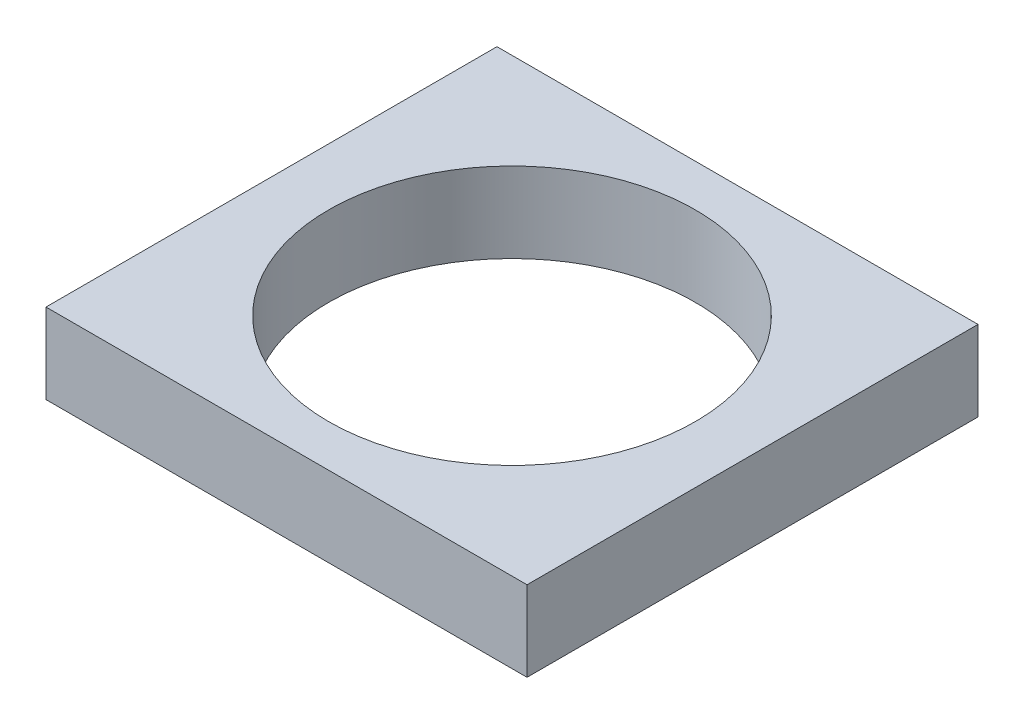
ISO-10303-21;
HEADER;
FILE_DESCRIPTION(('STEP AP214'),'2;1');
FILE_NAME('part.step','',(''),(''),'','','');
FILE_SCHEMA(('AUTOMOTIVE_DESIGN { 1 0 10303 214 1 1 1 1 }'));
ENDSEC;
DATA;
#1=APPLICATION_CONTEXT('core data for automotive mechanical design processes');
#2=APPLICATION_PROTOCOL_DEFINITION('international standard','automotive_design',2000,#1);
#3=PRODUCT_CONTEXT('',#1,'mechanical');
#4=PRODUCT('Part','Part','',(#3));
#5=PRODUCT_RELATED_PRODUCT_CATEGORY('part','',(#4));
#6=PRODUCT_DEFINITION_FORMATION('','',#4);
#7=PRODUCT_DEFINITION_CONTEXT('part definition',#1,'design');
#8=PRODUCT_DEFINITION('design','',#6,#7);
#9=PRODUCT_DEFINITION_SHAPE('','',#8);
#10=(LENGTH_UNIT() NAMED_UNIT(*) SI_UNIT(.MILLI.,.METRE.));
#11=(NAMED_UNIT(*) PLANE_ANGLE_UNIT() SI_UNIT($,.RADIAN.));
#12=(NAMED_UNIT(*) SI_UNIT($,.STERADIAN.) SOLID_ANGLE_UNIT());
#13=UNCERTAINTY_MEASURE_WITH_UNIT(LENGTH_MEASURE(1.E-05),#10,'distance_accuracy_value','');
#14=(GEOMETRIC_REPRESENTATION_CONTEXT(3) GLOBAL_UNCERTAINTY_ASSIGNED_CONTEXT((#13)) GLOBAL_UNIT_ASSIGNED_CONTEXT((#10,
#11,#12)) REPRESENTATION_CONTEXT('',''));
#15=CARTESIAN_POINT('',(0.,0.,0.));
#16=DIRECTION('',(0.,0.,1.));
#17=DIRECTION('',(1.,0.,0.));
#18=AXIS2_PLACEMENT_3D('',#15,#16,#17);
#19=CARTESIAN_POINT('',(0.,4.,0.));
#20=DIRECTION('',(1.,0.,0.));
#21=DIRECTION('',(0.,0.,-1.));
#22=AXIS2_PLACEMENT_3D('',#19,#20,#21);
#23=PLANE('',#22);
#24=DIRECTION('',(0.,0.,1.));
#25=VECTOR('',#24,1.);
#26=CARTESIAN_POINT('',(0.,0.,0.));
#27=LINE('',#26,#25);
#28=CARTESIAN_POINT('',(0.,0.,0.));
#29=VERTEX_POINT('',#28);
#30=CARTESIAN_POINT('',(0.,0.,22.5));
#31=VERTEX_POINT('',#30);
#32=EDGE_CURVE('E96',#29,#31,#27,.T.);
#33=ORIENTED_EDGE('',*,*,#32,.T.);
#34=DIRECTION('',(0.,-1.,0.));
#35=VECTOR('',#34,1.);
#36=CARTESIAN_POINT('',(0.,4.,22.5));
#37=LINE('',#36,#35);
#38=CARTESIAN_POINT('',(0.,4.,22.5));
#39=VERTEX_POINT('',#38);
#40=EDGE_CURVE('E11',#39,#31,#37,.T.);
#41=ORIENTED_EDGE('',*,*,#40,.F.);
#42=DIRECTION('',(0.,0.,1.));
#43=VECTOR('',#42,1.);
#44=CARTESIAN_POINT('',(0.,4.,0.));
#45=LINE('',#44,#43);
#46=CARTESIAN_POINT('',(0.,4.,0.));
#47=VERTEX_POINT('',#46);
#48=EDGE_CURVE('E84',#47,#39,#45,.T.);
#49=ORIENTED_EDGE('',*,*,#48,.F.);
#50=DIRECTION('',(0.,-1.,0.));
#51=VECTOR('',#50,1.);
#52=CARTESIAN_POINT('',(0.,4.,0.));
#53=LINE('',#52,#51);
#54=EDGE_CURVE('E92',#47,#29,#53,.T.);
#55=ORIENTED_EDGE('',*,*,#54,.T.);
#56=EDGE_LOOP('',(#33,#41,#49,#55));
#57=FACE_BOUND('',#56,.T.);
#58=ADVANCED_FACE('F33',(#57),#23,.F.);
#59=CARTESIAN_POINT('',(0.,4.,22.5));
#60=DIRECTION('',(0.,0.,-1.));
#61=DIRECTION('',(-1.,0.,0.));
#62=AXIS2_PLACEMENT_3D('',#59,#60,#61);
#63=PLANE('',#62);
#64=DIRECTION('',(1.,0.,0.));
#65=VECTOR('',#64,1.);
#66=CARTESIAN_POINT('',(0.,0.,22.5));
#67=LINE('',#66,#65);
#68=CARTESIAN_POINT('',(24.,0.,22.5));
#69=VERTEX_POINT('',#68);
#70=EDGE_CURVE('E88',#31,#69,#67,.T.);
#71=ORIENTED_EDGE('',*,*,#70,.T.);
#72=DIRECTION('',(0.,-1.,0.));
#73=VECTOR('',#72,1.);
#74=CARTESIAN_POINT('',(24.,4.,22.5));
#75=LINE('',#74,#73);
#76=CARTESIAN_POINT('',(24.,4.,22.5));
#77=VERTEX_POINT('',#76);
#78=EDGE_CURVE('E41',#77,#69,#75,.T.);
#79=ORIENTED_EDGE('',*,*,#78,.F.);
#80=DIRECTION('',(1.,0.,0.));
#81=VECTOR('',#80,1.);
#82=CARTESIAN_POINT('',(0.,4.,22.5));
#83=LINE('',#82,#81);
#84=EDGE_CURVE('E79',#39,#77,#83,.T.);
#85=ORIENTED_EDGE('',*,*,#84,.F.);
#86=ORIENTED_EDGE('',*,*,#40,.T.);
#87=EDGE_LOOP('',(#71,#79,#85,#86));
#88=FACE_BOUND('',#87,.T.);
#89=ADVANCED_FACE('F87',(#88),#63,.F.);
#90=CARTESIAN_POINT('',(24.,4.,0.));
#91=DIRECTION('',(-1.,0.,0.));
#92=DIRECTION('',(0.,0.,1.));
#93=AXIS2_PLACEMENT_3D('',#90,#91,#92);
#94=PLANE('',#93);
#95=DIRECTION('',(0.,0.,-1.));
#96=VECTOR('',#95,1.);
#97=CARTESIAN_POINT('',(24.,0.,0.));
#98=LINE('',#97,#96);
#99=CARTESIAN_POINT('',(24.,0.,0.));
#100=VERTEX_POINT('',#99);
#101=EDGE_CURVE('E66',#69,#100,#98,.T.);
#102=ORIENTED_EDGE('',*,*,#101,.T.);
#103=DIRECTION('',(0.,-1.,0.));
#104=VECTOR('',#103,1.);
#105=CARTESIAN_POINT('',(24.,4.,0.));
#106=LINE('',#105,#104);
#107=CARTESIAN_POINT('',(24.,4.,0.));
#108=VERTEX_POINT('',#107);
#109=EDGE_CURVE('E89',#108,#100,#106,.T.);
#110=ORIENTED_EDGE('',*,*,#109,.F.);
#111=DIRECTION('',(0.,0.,-1.));
#112=VECTOR('',#111,1.);
#113=CARTESIAN_POINT('',(24.,4.,0.));
#114=LINE('',#113,#112);
#115=EDGE_CURVE('E82',#77,#108,#114,.T.);
#116=ORIENTED_EDGE('',*,*,#115,.F.);
#117=ORIENTED_EDGE('',*,*,#78,.T.);
#118=EDGE_LOOP('',(#102,#110,#116,#117));
#119=FACE_BOUND('',#118,.T.);
#120=ADVANCED_FACE('F90',(#119),#94,.F.);
#121=CARTESIAN_POINT('',(0.,4.,0.));
#122=DIRECTION('',(0.,0.,1.));
#123=DIRECTION('',(1.,0.,0.));
#124=AXIS2_PLACEMENT_3D('',#121,#122,#123);
#125=PLANE('',#124);
#126=DIRECTION('',(-1.,0.,0.));
#127=VECTOR('',#126,1.);
#128=CARTESIAN_POINT('',(0.,0.,0.));
#129=LINE('',#128,#127);
#130=EDGE_CURVE('E72',#100,#29,#129,.T.);
#131=ORIENTED_EDGE('',*,*,#130,.T.);
#132=ORIENTED_EDGE('',*,*,#54,.F.);
#133=DIRECTION('',(-1.,0.,0.));
#134=VECTOR('',#133,1.);
#135=CARTESIAN_POINT('',(0.,4.,0.));
#136=LINE('',#135,#134);
#137=EDGE_CURVE('E49',#108,#47,#136,.T.);
#138=ORIENTED_EDGE('',*,*,#137,.F.);
#139=ORIENTED_EDGE('',*,*,#109,.T.);
#140=EDGE_LOOP('',(#131,#132,#138,#139));
#141=FACE_BOUND('',#140,.T.);
#142=ADVANCED_FACE('F104',(#141),#125,.F.);
#143=CARTESIAN_POINT('',(0.,4.,0.));
#144=DIRECTION('',(0.,1.,0.));
#145=DIRECTION('',(0.,0.,1.));
#146=AXIS2_PLACEMENT_3D('',#143,#144,#145);
#147=PLANE('',#146);
#148=CARTESIAN_POINT('',(12.,4.,11.25));
#149=DIRECTION('',(0.,1.,0.));
#150=DIRECTION('',(0.,0.,1.));
#151=AXIS2_PLACEMENT_3D('',#148,#149,#150);
#152=CIRCLE('',#151,9.15);
#153=CARTESIAN_POINT('',(12.,4.,20.4));
#154=VERTEX_POINT('',#153);
#155=EDGE_CURVE('E110',#154,#154,#152,.T.);
#156=ORIENTED_EDGE('',*,*,#155,.F.);
#157=EDGE_LOOP('',(#156));
#158=FACE_BOUND('',#157,.T.);
#159=ORIENTED_EDGE('',*,*,#48,.T.);
#160=ORIENTED_EDGE('',*,*,#84,.T.);
#161=ORIENTED_EDGE('',*,*,#115,.T.);
#162=ORIENTED_EDGE('',*,*,#137,.T.);
#163=EDGE_LOOP('',(#159,#160,#161,#162));
#164=FACE_BOUND('',#163,.T.);
#165=ADVANCED_FACE('F80',(#158,#164),#147,.T.);
#166=CARTESIAN_POINT('',(0.,0.,0.));
#167=DIRECTION('',(0.,1.,0.));
#168=DIRECTION('',(0.,0.,1.));
#169=AXIS2_PLACEMENT_3D('',#166,#167,#168);
#170=PLANE('',#169);
#171=CARTESIAN_POINT('',(12.,0.,11.25));
#172=DIRECTION('',(0.,1.,0.));
#173=DIRECTION('',(0.,0.,1.));
#174=AXIS2_PLACEMENT_3D('',#171,#172,#173);
#175=CIRCLE('',#174,9.15);
#176=CARTESIAN_POINT('',(12.,0.,20.4));
#177=VERTEX_POINT('',#176);
#178=EDGE_CURVE('E99',#177,#177,#175,.T.);
#179=ORIENTED_EDGE('',*,*,#178,.T.);
#180=EDGE_LOOP('',(#179));
#181=FACE_BOUND('',#180,.T.);
#182=ORIENTED_EDGE('',*,*,#32,.F.);
#183=ORIENTED_EDGE('',*,*,#130,.F.);
#184=ORIENTED_EDGE('',*,*,#101,.F.);
#185=ORIENTED_EDGE('',*,*,#70,.F.);
#186=EDGE_LOOP('',(#182,#183,#184,#185));
#187=FACE_BOUND('',#186,.T.);
#188=ADVANCED_FACE('F107',(#181,#187),#170,.F.);
#189=CARTESIAN_POINT('',(12.,0.,11.25));
#190=DIRECTION('',(0.,1.,0.));
#191=DIRECTION('',(0.,0.,1.));
#192=AXIS2_PLACEMENT_3D('',#189,#190,#191);
#193=CYLINDRICAL_SURFACE('',#192,9.15);
#194=ORIENTED_EDGE('',*,*,#178,.F.);
#195=EDGE_LOOP('',(#194));
#196=FACE_BOUND('',#195,.T.);
#197=ORIENTED_EDGE('',*,*,#155,.T.);
#198=EDGE_LOOP('',(#197));
#199=FACE_BOUND('',#198,.T.);
#200=ADVANCED_FACE('F117',(#196,#199),#193,.F.);
#201=CLOSED_SHELL('',(#58,#89,#120,#142,#165,#188,#200));
#202=MANIFOLD_SOLID_BREP('B2',#201);
#203=ADVANCED_BREP_SHAPE_REPRESENTATION('',(#18,#202),#14);
#204=SHAPE_DEFINITION_REPRESENTATION(#9,#203);
ENDSEC;
END-ISO-10303-21;
